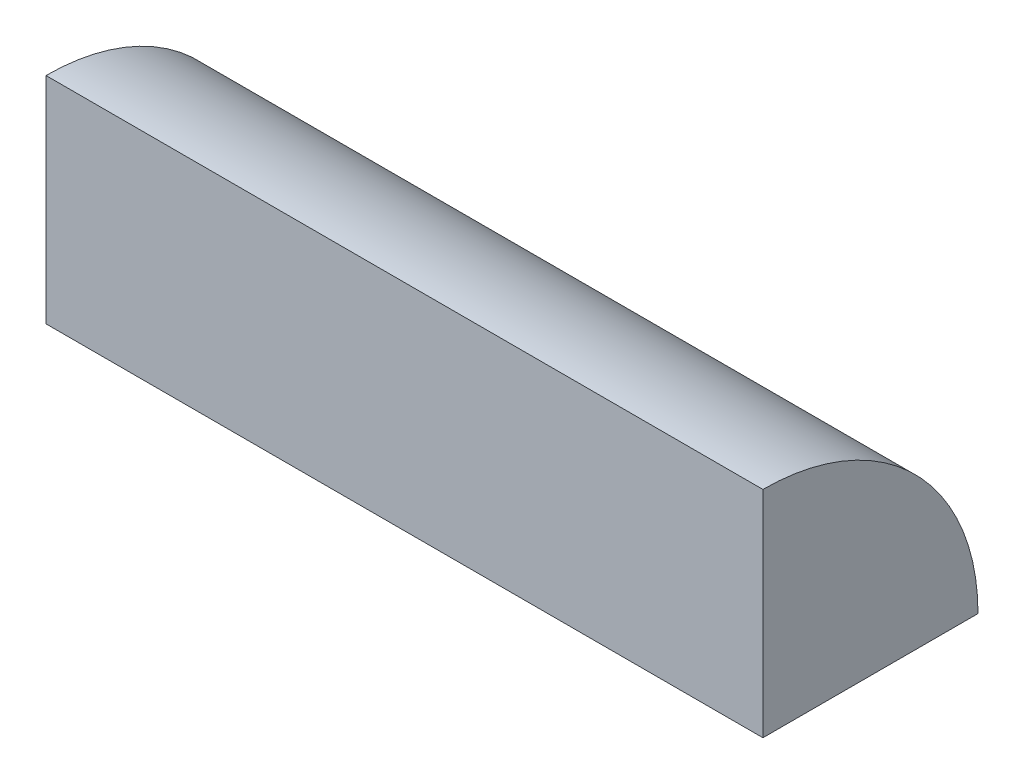
ISO-10303-21;
HEADER;
FILE_DESCRIPTION(('STEP AP214'),'2;1');
FILE_NAME('part.step','',(''),(''),'','','');
FILE_SCHEMA(('AUTOMOTIVE_DESIGN { 1 0 10303 214 1 1 1 1 }'));
ENDSEC;
DATA;
#1=APPLICATION_CONTEXT('core data for automotive mechanical design processes');
#2=APPLICATION_PROTOCOL_DEFINITION('international standard','automotive_design',2000,#1);
#3=PRODUCT_CONTEXT('',#1,'mechanical');
#4=PRODUCT('Part','Part','',(#3));
#5=PRODUCT_RELATED_PRODUCT_CATEGORY('part','',(#4));
#6=PRODUCT_DEFINITION_FORMATION('','',#4);
#7=PRODUCT_DEFINITION_CONTEXT('part definition',#1,'design');
#8=PRODUCT_DEFINITION('design','',#6,#7);
#9=PRODUCT_DEFINITION_SHAPE('','',#8);
#10=(LENGTH_UNIT() NAMED_UNIT(*) SI_UNIT(.MILLI.,.METRE.));
#11=(NAMED_UNIT(*) PLANE_ANGLE_UNIT() SI_UNIT($,.RADIAN.));
#12=(NAMED_UNIT(*) SI_UNIT($,.STERADIAN.) SOLID_ANGLE_UNIT());
#13=UNCERTAINTY_MEASURE_WITH_UNIT(LENGTH_MEASURE(1.E-05),#10,'distance_accuracy_value','');
#14=(GEOMETRIC_REPRESENTATION_CONTEXT(3) GLOBAL_UNCERTAINTY_ASSIGNED_CONTEXT((#13)) GLOBAL_UNIT_ASSIGNED_CONTEXT((#10,
#11,#12)) REPRESENTATION_CONTEXT('',''));
#15=CARTESIAN_POINT('',(0.,0.,0.));
#16=DIRECTION('',(0.,0.,1.));
#17=DIRECTION('',(1.,0.,0.));
#18=AXIS2_PLACEMENT_3D('',#15,#16,#17);
#19=CARTESIAN_POINT('',(0.,164.99,-550.01));
#20=DIRECTION('',(-1.,0.,0.));
#21=DIRECTION('',(0.,0.,1.));
#22=AXIS2_PLACEMENT_3D('',#19,#20,#21);
#23=PLANE('',#22);
#24=DIRECTION('',(0.,0.,-1.));
#25=VECTOR('',#24,1.);
#26=CARTESIAN_POINT('',(0.,165.,-542.5));
#27=LINE('',#26,#25);
#28=CARTESIAN_POINT('',(0.,165.,-535.));
#29=VERTEX_POINT('',#28);
#30=CARTESIAN_POINT('',(0.,165.,-550.));
#31=VERTEX_POINT('',#30);
#32=EDGE_CURVE('E50',#29,#31,#27,.T.);
#33=ORIENTED_EDGE('',*,*,#32,.F.);
#34=DIRECTION('',(0.,-1.,0.));
#35=VECTOR('',#34,1.);
#36=CARTESIAN_POINT('',(0.,172.5,-535.));
#37=LINE('',#36,#35);
#38=CARTESIAN_POINT('',(0.,180.,-535.));
#39=VERTEX_POINT('',#38);
#40=EDGE_CURVE('E52',#39,#29,#37,.T.);
#41=ORIENTED_EDGE('',*,*,#40,.F.);
#42=CARTESIAN_POINT('',(0.,165.,-535.));
#43=DIRECTION('',(1.,0.,0.));
#44=DIRECTION('',(0.,0.,-1.));
#45=AXIS2_PLACEMENT_3D('',#42,#43,#44);
#46=CIRCLE('',#45,15.);
#47=EDGE_CURVE('E21',#31,#39,#46,.T.);
#48=ORIENTED_EDGE('',*,*,#47,.F.);
#49=EDGE_LOOP('',(#33,#41,#48));
#50=FACE_BOUND('',#49,.T.);
#51=ADVANCED_FACE('F17',(#50),#23,.T.);
#52=CARTESIAN_POINT('',(50.01,164.99,-535.));
#53=DIRECTION('',(0.,0.,1.));
#54=DIRECTION('',(0.,1.,0.));
#55=AXIS2_PLACEMENT_3D('',#52,#53,#54);
#56=PLANE('',#55);
#57=DIRECTION('',(0.,-1.,0.));
#58=VECTOR('',#57,1.);
#59=CARTESIAN_POINT('',(50.,172.5,-535.));
#60=LINE('',#59,#58);
#61=CARTESIAN_POINT('',(50.,180.,-535.));
#62=VERTEX_POINT('',#61);
#63=CARTESIAN_POINT('',(50.,165.,-535.));
#64=VERTEX_POINT('',#63);
#65=EDGE_CURVE('E74',#62,#64,#60,.T.);
#66=ORIENTED_EDGE('',*,*,#65,.F.);
#67=DIRECTION('',(1.,0.,0.));
#68=VECTOR('',#67,1.);
#69=CARTESIAN_POINT('',(25.,180.,-535.));
#70=LINE('',#69,#68);
#71=EDGE_CURVE('E60',#39,#62,#70,.T.);
#72=ORIENTED_EDGE('',*,*,#71,.F.);
#73=ORIENTED_EDGE('',*,*,#40,.T.);
#74=DIRECTION('',(-1.,0.,0.));
#75=VECTOR('',#74,1.);
#76=CARTESIAN_POINT('',(25.,165.,-535.));
#77=LINE('',#76,#75);
#78=EDGE_CURVE('E55',#64,#29,#77,.T.);
#79=ORIENTED_EDGE('',*,*,#78,.F.);
#80=EDGE_LOOP('',(#66,#72,#73,#79));
#81=FACE_BOUND('',#80,.T.);
#82=ADVANCED_FACE('F58',(#81),#56,.T.);
#83=CARTESIAN_POINT('',(50.01,165.,-550.01));
#84=DIRECTION('',(0.,-1.,0.));
#85=DIRECTION('',(0.,0.,1.));
#86=AXIS2_PLACEMENT_3D('',#83,#84,#85);
#87=PLANE('',#86);
#88=DIRECTION('',(0.,0.,-1.));
#89=VECTOR('',#88,1.);
#90=CARTESIAN_POINT('',(50.,165.,-542.5));
#91=LINE('',#90,#89);
#92=CARTESIAN_POINT('',(50.,165.,-550.));
#93=VERTEX_POINT('',#92);
#94=EDGE_CURVE('E27',#64,#93,#91,.T.);
#95=ORIENTED_EDGE('',*,*,#94,.F.);
#96=ORIENTED_EDGE('',*,*,#78,.T.);
#97=ORIENTED_EDGE('',*,*,#32,.T.);
#98=DIRECTION('',(-1.,0.,0.));
#99=VECTOR('',#98,1.);
#100=CARTESIAN_POINT('',(25.,165.,-550.));
#101=LINE('',#100,#99);
#102=EDGE_CURVE('E35',#93,#31,#101,.T.);
#103=ORIENTED_EDGE('',*,*,#102,.F.);
#104=EDGE_LOOP('',(#95,#96,#97,#103));
#105=FACE_BOUND('',#104,.T.);
#106=ADVANCED_FACE('F62',(#105),#87,.T.);
#107=CARTESIAN_POINT('',(0.,165.,-535.));
#108=DIRECTION('',(1.,0.,0.));
#109=DIRECTION('',(0.,0.,-1.));
#110=AXIS2_PLACEMENT_3D('',#107,#108,#109);
#111=CYLINDRICAL_SURFACE('',#110,15.);
#112=CARTESIAN_POINT('',(50.,165.,-535.));
#113=DIRECTION('',(1.,0.,0.));
#114=DIRECTION('',(0.,0.,-1.));
#115=AXIS2_PLACEMENT_3D('',#112,#113,#114);
#116=CIRCLE('',#115,15.);
#117=EDGE_CURVE('E11',#93,#62,#116,.T.);
#118=ORIENTED_EDGE('',*,*,#117,.F.);
#119=ORIENTED_EDGE('',*,*,#102,.T.);
#120=ORIENTED_EDGE('',*,*,#47,.T.);
#121=ORIENTED_EDGE('',*,*,#71,.T.);
#122=EDGE_LOOP('',(#118,#119,#120,#121));
#123=FACE_BOUND('',#122,.T.);
#124=ADVANCED_FACE('F83',(#123),#111,.T.);
#125=CARTESIAN_POINT('',(50.,164.99,-534.99));
#126=DIRECTION('',(1.,0.,0.));
#127=DIRECTION('',(0.,0.,-1.));
#128=AXIS2_PLACEMENT_3D('',#125,#126,#127);
#129=PLANE('',#128);
#130=ORIENTED_EDGE('',*,*,#94,.T.);
#131=ORIENTED_EDGE('',*,*,#117,.T.);
#132=ORIENTED_EDGE('',*,*,#65,.T.);
#133=EDGE_LOOP('',(#130,#131,#132));
#134=FACE_BOUND('',#133,.T.);
#135=ADVANCED_FACE('F19',(#134),#129,.T.);
#136=CLOSED_SHELL('',(#51,#82,#106,#124,#135));
#137=MANIFOLD_SOLID_BREP('B1',#136);
#138=ADVANCED_BREP_SHAPE_REPRESENTATION('',(#18,#137),#14);
#139=SHAPE_DEFINITION_REPRESENTATION(#9,#138);
ENDSEC;
END-ISO-10303-21;
